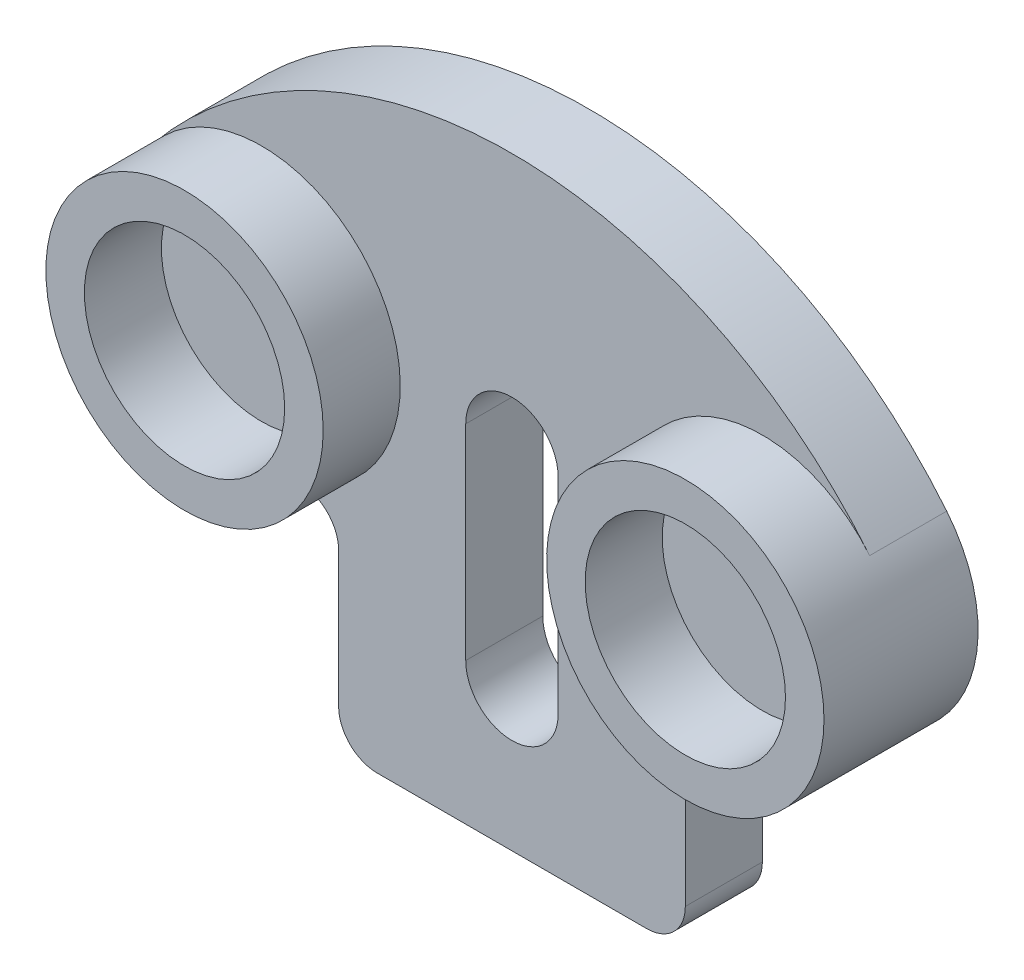
ISO-10303-21;
HEADER;
FILE_DESCRIPTION(('STEP AP214'),'2;1');
FILE_NAME('part.step','',(''),(''),'','','');
FILE_SCHEMA(('AUTOMOTIVE_DESIGN { 1 0 10303 214 1 1 1 1 }'));
ENDSEC;
DATA;
#1=APPLICATION_CONTEXT('core data for automotive mechanical design processes');
#2=APPLICATION_PROTOCOL_DEFINITION('international standard','automotive_design',2000,#1);
#3=PRODUCT_CONTEXT('',#1,'mechanical');
#4=PRODUCT('Part','Part','',(#3));
#5=PRODUCT_RELATED_PRODUCT_CATEGORY('part','',(#4));
#6=PRODUCT_DEFINITION_FORMATION('','',#4);
#7=PRODUCT_DEFINITION_CONTEXT('part definition',#1,'design');
#8=PRODUCT_DEFINITION('design','',#6,#7);
#9=PRODUCT_DEFINITION_SHAPE('','',#8);
#10=(LENGTH_UNIT() NAMED_UNIT(*) SI_UNIT(.MILLI.,.METRE.));
#11=(NAMED_UNIT(*) PLANE_ANGLE_UNIT() SI_UNIT($,.RADIAN.));
#12=(NAMED_UNIT(*) SI_UNIT($,.STERADIAN.) SOLID_ANGLE_UNIT());
#13=UNCERTAINTY_MEASURE_WITH_UNIT(LENGTH_MEASURE(1.E-05),#10,'distance_accuracy_value','');
#14=(GEOMETRIC_REPRESENTATION_CONTEXT(3) GLOBAL_UNCERTAINTY_ASSIGNED_CONTEXT((#13)) GLOBAL_UNIT_ASSIGNED_CONTEXT((#10,
#11,#12)) REPRESENTATION_CONTEXT('',''));
#15=CARTESIAN_POINT('',(0.,0.,0.));
#16=DIRECTION('',(0.,0.,1.));
#17=DIRECTION('',(1.,0.,0.));
#18=AXIS2_PLACEMENT_3D('',#15,#16,#17);
#19=CARTESIAN_POINT('',(-5.99999999999995,0.,10.));
#20=DIRECTION('',(-1.,0.,0.));
#21=DIRECTION('',(0.,0.,1.));
#22=AXIS2_PLACEMENT_3D('',#19,#20,#21);
#23=PLANE('',#22);
#24=DIRECTION('',(0.,1.,0.));
#25=VECTOR('',#24,1.);
#26=CARTESIAN_POINT('',(-5.99999999999995,0.,0.));
#27=LINE('',#26,#25);
#28=CARTESIAN_POINT('',(-5.99999999999995,0.,0.));
#29=VERTEX_POINT('',#28);
#30=CARTESIAN_POINT('',(-5.99999999999995,26.603571188846,0.));
#31=VERTEX_POINT('',#30);
#32=EDGE_CURVE('E231',#29,#31,#27,.T.);
#33=ORIENTED_EDGE('',*,*,#32,.T.);
#34=DIRECTION('',(0.,0.,-1.));
#35=VECTOR('',#34,1.);
#36=CARTESIAN_POINT('',(-5.99999999999995,26.603571188846,10.));
#37=LINE('',#36,#35);
#38=CARTESIAN_POINT('',(-5.99999999999995,26.603571188846,10.));
#39=VERTEX_POINT('',#38);
#40=EDGE_CURVE('E68',#39,#31,#37,.T.);
#41=ORIENTED_EDGE('',*,*,#40,.F.);
#42=DIRECTION('',(0.,1.,0.));
#43=VECTOR('',#42,1.);
#44=CARTESIAN_POINT('',(-5.99999999999995,0.,10.));
#45=LINE('',#44,#43);
#46=CARTESIAN_POINT('',(-5.99999999999995,0.,10.));
#47=VERTEX_POINT('',#46);
#48=EDGE_CURVE('E172',#47,#39,#45,.T.);
#49=ORIENTED_EDGE('',*,*,#48,.F.);
#50=DIRECTION('',(0.,0.,-1.));
#51=VECTOR('',#50,1.);
#52=CARTESIAN_POINT('',(-5.99999999999995,0.,10.));
#53=LINE('',#52,#51);
#54=EDGE_CURVE('E242',#47,#29,#53,.T.);
#55=ORIENTED_EDGE('',*,*,#54,.T.);
#56=EDGE_LOOP('',(#33,#41,#49,#55));
#57=FACE_BOUND('',#56,.T.);
#58=ADVANCED_FACE('F57',(#57),#23,.F.);
#59=CARTESIAN_POINT('',(0.,26.603571188846,10.));
#60=DIRECTION('',(0.,0.,-1.));
#61=DIRECTION('',(-1.,0.,0.));
#62=AXIS2_PLACEMENT_3D('',#59,#60,#61);
#63=CYLINDRICAL_SURFACE('',#62,5.99999999999999);
#64=CARTESIAN_POINT('',(0.,26.603571188846,0.));
#65=DIRECTION('',(0.,0.,1.));
#66=DIRECTION('',(1.,0.,0.));
#67=AXIS2_PLACEMENT_3D('',#64,#65,#66);
#68=CIRCLE('',#67,5.99999999999999);
#69=CARTESIAN_POINT('',(6.00000000000004,26.603571188846,0.));
#70=VERTEX_POINT('',#69);
#71=EDGE_CURVE('E180',#31,#70,#68,.F.);
#72=ORIENTED_EDGE('',*,*,#71,.T.);
#73=DIRECTION('',(0.,0.,-1.));
#74=VECTOR('',#73,1.);
#75=CARTESIAN_POINT('',(6.00000000000004,26.603571188846,10.));
#76=LINE('',#75,#74);
#77=CARTESIAN_POINT('',(6.00000000000004,26.603571188846,10.));
#78=VERTEX_POINT('',#77);
#79=EDGE_CURVE('E178',#78,#70,#76,.T.);
#80=ORIENTED_EDGE('',*,*,#79,.F.);
#81=CARTESIAN_POINT('',(0.,26.603571188846,10.));
#82=DIRECTION('',(0.,0.,1.));
#83=DIRECTION('',(1.,0.,0.));
#84=AXIS2_PLACEMENT_3D('',#81,#82,#83);
#85=CIRCLE('',#84,5.99999999999999);
#86=EDGE_CURVE('E166',#39,#78,#85,.F.);
#87=ORIENTED_EDGE('',*,*,#86,.F.);
#88=ORIENTED_EDGE('',*,*,#40,.T.);
#89=EDGE_LOOP('',(#72,#80,#87,#88));
#90=FACE_BOUND('',#89,.T.);
#91=ADVANCED_FACE('F179',(#90),#63,.F.);
#92=CARTESIAN_POINT('',(6.00000000000006,0.,10.));
#93=DIRECTION('',(1.,0.,0.));
#94=DIRECTION('',(0.,1.,0.));
#95=AXIS2_PLACEMENT_3D('',#92,#93,#94);
#96=PLANE('',#95);
#97=DIRECTION('',(0.,-1.,0.));
#98=VECTOR('',#97,1.);
#99=CARTESIAN_POINT('',(6.00000000000006,0.,0.));
#100=LINE('',#99,#98);
#101=CARTESIAN_POINT('',(6.00000000000006,0.,0.));
#102=VERTEX_POINT('',#101);
#103=EDGE_CURVE('E125',#70,#102,#100,.T.);
#104=ORIENTED_EDGE('',*,*,#103,.T.);
#105=DIRECTION('',(0.,0.,-1.));
#106=VECTOR('',#105,1.);
#107=CARTESIAN_POINT('',(6.00000000000006,0.,10.));
#108=LINE('',#107,#106);
#109=CARTESIAN_POINT('',(6.00000000000006,0.,10.));
#110=VERTEX_POINT('',#109);
#111=EDGE_CURVE('E182',#110,#102,#108,.T.);
#112=ORIENTED_EDGE('',*,*,#111,.F.);
#113=DIRECTION('',(0.,-1.,0.));
#114=VECTOR('',#113,1.);
#115=CARTESIAN_POINT('',(6.00000000000006,0.,10.));
#116=LINE('',#115,#114);
#117=EDGE_CURVE('E170',#78,#110,#116,.T.);
#118=ORIENTED_EDGE('',*,*,#117,.F.);
#119=ORIENTED_EDGE('',*,*,#79,.T.);
#120=EDGE_LOOP('',(#104,#112,#118,#119));
#121=FACE_BOUND('',#120,.T.);
#122=ADVANCED_FACE('F184',(#121),#96,.F.);
#123=CARTESIAN_POINT('',(-17.5,-13.3964288111539,10.));
#124=DIRECTION('',(0.,0.,-1.));
#125=DIRECTION('',(-1.,0.,0.));
#126=AXIS2_PLACEMENT_3D('',#123,#124,#125);
#127=CYLINDRICAL_SURFACE('',#126,5.);
#128=CARTESIAN_POINT('',(-17.5,-13.3964288111539,0.));
#129=DIRECTION('',(0.,0.,1.));
#130=DIRECTION('',(1.,0.,0.));
#131=AXIS2_PLACEMENT_3D('',#128,#129,#130);
#132=CIRCLE('',#131,5.);
#133=CARTESIAN_POINT('',(-17.5,-18.3964288111539,0.));
#134=VERTEX_POINT('',#133);
#135=CARTESIAN_POINT('',(-22.5,-13.3964288111539,0.));
#136=VERTEX_POINT('',#135);
#137=EDGE_CURVE('E192',#134,#136,#132,.F.);
#138=ORIENTED_EDGE('',*,*,#137,.F.);
#139=DIRECTION('',(0.,0.,-1.));
#140=VECTOR('',#139,1.);
#141=CARTESIAN_POINT('',(-17.5,-18.3964288111539,10.));
#142=LINE('',#141,#140);
#143=CARTESIAN_POINT('',(-17.5,-18.3964288111539,10.));
#144=VERTEX_POINT('',#143);
#145=EDGE_CURVE('E61',#144,#134,#142,.T.);
#146=ORIENTED_EDGE('',*,*,#145,.F.);
#147=CARTESIAN_POINT('',(-17.5,-13.3964288111539,10.));
#148=DIRECTION('',(0.,0.,1.));
#149=DIRECTION('',(1.,0.,0.));
#150=AXIS2_PLACEMENT_3D('',#147,#148,#149);
#151=CIRCLE('',#150,5.);
#152=CARTESIAN_POINT('',(-22.5,-13.3964288111539,10.));
#153=VERTEX_POINT('',#152);
#154=EDGE_CURVE('E241',#144,#153,#151,.F.);
#155=ORIENTED_EDGE('',*,*,#154,.T.);
#156=DIRECTION('',(0.,0.,-1.));
#157=VECTOR('',#156,1.);
#158=CARTESIAN_POINT('',(-22.5,-13.3964288111539,10.));
#159=LINE('',#158,#157);
#160=EDGE_CURVE('E188',#153,#136,#159,.T.);
#161=ORIENTED_EDGE('',*,*,#160,.T.);
#162=EDGE_LOOP('',(#138,#146,#155,#161));
#163=FACE_BOUND('',#162,.T.);
#164=ADVANCED_FACE('F59',(#163),#127,.T.);
#165=CARTESIAN_POINT('',(0.,-18.3964288111539,10.));
#166=DIRECTION('',(0.,-1.,0.));
#167=DIRECTION('',(0.,0.,-1.));
#168=AXIS2_PLACEMENT_3D('',#165,#166,#167);
#169=PLANE('',#168);
#170=DIRECTION('',(-1.,0.,0.));
#171=VECTOR('',#170,1.);
#172=CARTESIAN_POINT('',(0.,-18.3964288111539,0.));
#173=LINE('',#172,#171);
#174=CARTESIAN_POINT('',(17.5,-18.3964288111539,0.));
#175=VERTEX_POINT('',#174);
#176=EDGE_CURVE('E196',#175,#134,#173,.T.);
#177=ORIENTED_EDGE('',*,*,#176,.F.);
#178=DIRECTION('',(0.,0.,-1.));
#179=VECTOR('',#178,1.);
#180=CARTESIAN_POINT('',(17.5,-18.3964288111539,10.));
#181=LINE('',#180,#179);
#182=CARTESIAN_POINT('',(17.5,-18.3964288111539,10.));
#183=VERTEX_POINT('',#182);
#184=EDGE_CURVE('E273',#183,#175,#181,.T.);
#185=ORIENTED_EDGE('',*,*,#184,.F.);
#186=DIRECTION('',(-1.,0.,0.));
#187=VECTOR('',#186,1.);
#188=CARTESIAN_POINT('',(0.,-18.3964288111539,10.));
#189=LINE('',#188,#187);
#190=EDGE_CURVE('E284',#183,#144,#189,.T.);
#191=ORIENTED_EDGE('',*,*,#190,.T.);
#192=ORIENTED_EDGE('',*,*,#145,.T.);
#193=EDGE_LOOP('',(#177,#185,#191,#192));
#194=FACE_BOUND('',#193,.T.);
#195=ADVANCED_FACE('F282',(#194),#169,.T.);
#196=CARTESIAN_POINT('',(17.5,-13.3964288111539,10.));
#197=DIRECTION('',(0.,0.,-1.));
#198=DIRECTION('',(-1.,0.,0.));
#199=AXIS2_PLACEMENT_3D('',#196,#197,#198);
#200=CYLINDRICAL_SURFACE('',#199,5.);
#201=CARTESIAN_POINT('',(17.5,-13.3964288111539,0.));
#202=DIRECTION('',(0.,0.,1.));
#203=DIRECTION('',(1.,0.,0.));
#204=AXIS2_PLACEMENT_3D('',#201,#202,#203);
#205=CIRCLE('',#204,5.);
#206=CARTESIAN_POINT('',(22.5,-13.3964288111539,0.));
#207=VERTEX_POINT('',#206);
#208=EDGE_CURVE('E201',#175,#207,#205,.T.);
#209=ORIENTED_EDGE('',*,*,#208,.T.);
#210=DIRECTION('',(0.,0.,-1.));
#211=VECTOR('',#210,1.);
#212=CARTESIAN_POINT('',(22.5,-13.3964288111539,10.));
#213=LINE('',#212,#211);
#214=CARTESIAN_POINT('',(22.5,-13.3964288111539,10.));
#215=VERTEX_POINT('',#214);
#216=EDGE_CURVE('E270',#215,#207,#213,.T.);
#217=ORIENTED_EDGE('',*,*,#216,.F.);
#218=CARTESIAN_POINT('',(17.5,-13.3964288111539,10.));
#219=DIRECTION('',(0.,0.,1.));
#220=DIRECTION('',(1.,0.,0.));
#221=AXIS2_PLACEMENT_3D('',#218,#219,#220);
#222=CIRCLE('',#221,5.);
#223=EDGE_CURVE('E302',#183,#215,#222,.T.);
#224=ORIENTED_EDGE('',*,*,#223,.F.);
#225=ORIENTED_EDGE('',*,*,#184,.T.);
#226=EDGE_LOOP('',(#209,#217,#224,#225));
#227=FACE_BOUND('',#226,.T.);
#228=ADVANCED_FACE('F291',(#227),#200,.T.);
#229=CARTESIAN_POINT('',(22.5,0.,10.));
#230=DIRECTION('',(-1.,0.,0.));
#231=DIRECTION('',(0.,-1.,0.));
#232=AXIS2_PLACEMENT_3D('',#229,#230,#231);
#233=PLANE('',#232);
#234=DIRECTION('',(0.,1.,0.));
#235=VECTOR('',#234,1.);
#236=CARTESIAN_POINT('',(22.5,0.,0.));
#237=LINE('',#236,#235);
#238=CARTESIAN_POINT('',(22.5,4.1536268682024,0.));
#239=VERTEX_POINT('',#238);
#240=EDGE_CURVE('E204',#207,#239,#237,.T.);
#241=ORIENTED_EDGE('',*,*,#240,.T.);
#242=DIRECTION('',(0.,0.,-1.));
#243=VECTOR('',#242,1.);
#244=CARTESIAN_POINT('',(22.5,4.1536268682024,10.));
#245=LINE('',#244,#243);
#246=CARTESIAN_POINT('',(22.5,4.1536268682024,10.));
#247=VERTEX_POINT('',#246);
#248=EDGE_CURVE('E267',#247,#239,#245,.T.);
#249=ORIENTED_EDGE('',*,*,#248,.F.);
#250=DIRECTION('',(0.,1.,0.));
#251=VECTOR('',#250,1.);
#252=CARTESIAN_POINT('',(22.5,0.,10.));
#253=LINE('',#252,#251);
#254=EDGE_CURVE('E296',#215,#247,#253,.T.);
#255=ORIENTED_EDGE('',*,*,#254,.F.);
#256=ORIENTED_EDGE('',*,*,#216,.T.);
#257=EDGE_LOOP('',(#241,#249,#255,#256));
#258=FACE_BOUND('',#257,.T.);
#259=ADVANCED_FACE('F294',(#258),#233,.F.);
#260=CARTESIAN_POINT('',(27.5,4.1536268682024,10.));
#261=DIRECTION('',(0.,0.,-1.));
#262=DIRECTION('',(-1.,0.,0.));
#263=AXIS2_PLACEMENT_3D('',#260,#261,#262);
#264=CYLINDRICAL_SURFACE('',#263,5.);
#265=CARTESIAN_POINT('',(27.5,4.1536268682024,0.));
#266=DIRECTION('',(0.,0.,1.));
#267=DIRECTION('',(1.,0.,0.));
#268=AXIS2_PLACEMENT_3D('',#265,#266,#267);
#269=CIRCLE('',#268,5.);
#270=CARTESIAN_POINT('',(28.5869565217391,9.03404954660319,0.));
#271=VERTEX_POINT('',#270);
#272=EDGE_CURVE('E208',#271,#239,#269,.T.);
#273=ORIENTED_EDGE('',*,*,#272,.F.);
#274=DIRECTION('',(0.,0.,-1.));
#275=VECTOR('',#274,1.);
#276=CARTESIAN_POINT('',(28.5869565217391,9.03404954660319,10.));
#277=LINE('',#276,#275);
#278=CARTESIAN_POINT('',(28.5869565217391,9.03404954660319,10.));
#279=VERTEX_POINT('',#278);
#280=EDGE_CURVE('E264',#279,#271,#277,.T.);
#281=ORIENTED_EDGE('',*,*,#280,.F.);
#282=CARTESIAN_POINT('',(27.5,4.1536268682024,10.));
#283=DIRECTION('',(0.,0.,1.));
#284=DIRECTION('',(1.,0.,0.));
#285=AXIS2_PLACEMENT_3D('',#282,#283,#284);
#286=CIRCLE('',#285,5.);
#287=EDGE_CURVE('E301',#279,#247,#286,.T.);
#288=ORIENTED_EDGE('',*,*,#287,.T.);
#289=ORIENTED_EDGE('',*,*,#248,.T.);
#290=EDGE_LOOP('',(#273,#281,#288,#289));
#291=FACE_BOUND('',#290,.T.);
#292=ADVANCED_FACE('F417',(#291),#264,.F.);
#293=CARTESIAN_POINT('',(32.5,26.6035711888461,10.));
#294=DIRECTION('',(0.,0.,-1.));
#295=DIRECTION('',(-1.,0.,0.));
#296=AXIS2_PLACEMENT_3D('',#293,#294,#295);
#297=CYLINDRICAL_SURFACE('',#296,18.);
#298=CARTESIAN_POINT('',(32.5,26.6035711888461,0.));
#299=DIRECTION('',(0.,0.,1.));
#300=DIRECTION('',(1.,0.,0.));
#301=AXIS2_PLACEMENT_3D('',#298,#299,#300);
#302=CIRCLE('',#301,18.);
#303=CARTESIAN_POINT('',(46.4285714285714,38.0051016983515,0.));
#304=VERTEX_POINT('',#303);
#305=EDGE_CURVE('E212',#271,#304,#302,.T.);
#306=ORIENTED_EDGE('',*,*,#305,.T.);
#307=DIRECTION('',(0.,0.,-1.));
#308=VECTOR('',#307,1.);
#309=CARTESIAN_POINT('',(46.4285714285714,38.0051016983515,10.));
#310=LINE('',#309,#308);
#311=CARTESIAN_POINT('',(46.4285714285714,38.0051016983515,10.));
#312=VERTEX_POINT('',#311);
#313=EDGE_CURVE('E260',#312,#304,#310,.T.);
#314=ORIENTED_EDGE('',*,*,#313,.F.);
#315=CARTESIAN_POINT('',(32.5,26.6035711888461,10.));
#316=DIRECTION('',(0.,0.,1.));
#317=DIRECTION('',(1.,0.,0.));
#318=AXIS2_PLACEMENT_3D('',#315,#316,#317);
#319=CIRCLE('',#318,18.);
#320=EDGE_CURVE('E347',#312,#279,#319,.T.);
#321=ORIENTED_EDGE('',*,*,#320,.T.);
#322=ORIENTED_EDGE('',*,*,#280,.T.);
#323=EDGE_LOOP('',(#306,#314,#321,#322));
#324=FACE_BOUND('',#323,.T.);
#325=CARTESIAN_POINT('',(32.5,26.6035711888461,20.));
#326=DIRECTION('',(0.,0.,1.));
#327=DIRECTION('',(1.,0.,0.));
#328=AXIS2_PLACEMENT_3D('',#325,#326,#327);
#329=CIRCLE('',#328,18.);
#330=CARTESIAN_POINT('',(50.5,26.6035711888461,20.));
#331=VERTEX_POINT('',#330);
#332=EDGE_CURVE('E349',#331,#331,#329,.T.);
#333=ORIENTED_EDGE('',*,*,#332,.F.);
#334=EDGE_LOOP('',(#333));
#335=FACE_BOUND('',#334,.T.);
#336=ADVANCED_FACE('F345',(#324,#335),#297,.T.);
#337=CARTESIAN_POINT('',(0.,0.,10.));
#338=DIRECTION('',(0.,0.,-1.));
#339=DIRECTION('',(-1.,0.,0.));
#340=AXIS2_PLACEMENT_3D('',#337,#338,#339);
#341=CYLINDRICAL_SURFACE('',#340,60.);
#342=CARTESIAN_POINT('',(0.,0.,0.));
#343=DIRECTION('',(0.,0.,1.));
#344=DIRECTION('',(1.,0.,0.));
#345=AXIS2_PLACEMENT_3D('',#342,#343,#344);
#346=CIRCLE('',#345,60.);
#347=CARTESIAN_POINT('',(-46.4285714285714,38.0051016983515,0.));
#348=VERTEX_POINT('',#347);
#349=EDGE_CURVE('E215',#304,#348,#346,.T.);
#350=ORIENTED_EDGE('',*,*,#349,.T.);
#351=DIRECTION('',(0.,0.,-1.));
#352=VECTOR('',#351,1.);
#353=CARTESIAN_POINT('',(-46.4285714285714,38.0051016983515,10.));
#354=LINE('',#353,#352);
#355=CARTESIAN_POINT('',(-46.4285714285714,38.0051016983515,10.));
#356=VERTEX_POINT('',#355);
#357=EDGE_CURVE('E257',#356,#348,#354,.T.);
#358=ORIENTED_EDGE('',*,*,#357,.F.);
#359=CARTESIAN_POINT('',(0.,0.,10.));
#360=DIRECTION('',(0.,0.,1.));
#361=DIRECTION('',(1.,0.,0.));
#362=AXIS2_PLACEMENT_3D('',#359,#360,#361);
#363=CIRCLE('',#362,60.);
#364=EDGE_CURVE('E306',#312,#356,#363,.T.);
#365=ORIENTED_EDGE('',*,*,#364,.F.);
#366=ORIENTED_EDGE('',*,*,#313,.T.);
#367=EDGE_LOOP('',(#350,#358,#365,#366));
#368=FACE_BOUND('',#367,.T.);
#369=ADVANCED_FACE('F339',(#368),#341,.T.);
#370=CARTESIAN_POINT('',(-32.5,26.6035711888461,10.));
#371=DIRECTION('',(0.,0.,-1.));
#372=DIRECTION('',(-1.,0.,0.));
#373=AXIS2_PLACEMENT_3D('',#370,#371,#372);
#374=CYLINDRICAL_SURFACE('',#373,18.);
#375=CARTESIAN_POINT('',(-32.5,26.6035711888461,0.));
#376=DIRECTION('',(0.,0.,1.));
#377=DIRECTION('',(1.,0.,0.));
#378=AXIS2_PLACEMENT_3D('',#375,#376,#377);
#379=CIRCLE('',#378,18.);
#380=CARTESIAN_POINT('',(-28.5869565217391,9.03404954660319,0.));
#381=VERTEX_POINT('',#380);
#382=EDGE_CURVE('E219',#381,#348,#379,.F.);
#383=ORIENTED_EDGE('',*,*,#382,.F.);
#384=DIRECTION('',(0.,0.,-1.));
#385=VECTOR('',#384,1.);
#386=CARTESIAN_POINT('',(-28.5869565217391,9.03404954660319,10.));
#387=LINE('',#386,#385);
#388=CARTESIAN_POINT('',(-28.5869565217391,9.03404954660319,10.));
#389=VERTEX_POINT('',#388);
#390=EDGE_CURVE('E254',#389,#381,#387,.T.);
#391=ORIENTED_EDGE('',*,*,#390,.F.);
#392=CARTESIAN_POINT('',(-32.5,26.6035711888461,10.));
#393=DIRECTION('',(0.,0.,1.));
#394=DIRECTION('',(1.,0.,0.));
#395=AXIS2_PLACEMENT_3D('',#392,#393,#394);
#396=CIRCLE('',#395,18.);
#397=EDGE_CURVE('E12',#389,#356,#396,.T.);
#398=ORIENTED_EDGE('',*,*,#397,.T.);
#399=ORIENTED_EDGE('',*,*,#357,.T.);
#400=EDGE_LOOP('',(#383,#391,#398,#399));
#401=FACE_BOUND('',#400,.T.);
#402=CARTESIAN_POINT('',(-32.5,26.6035711888461,20.));
#403=DIRECTION('',(0.,0.,1.));
#404=DIRECTION('',(1.,0.,0.));
#405=AXIS2_PLACEMENT_3D('',#402,#403,#404);
#406=CIRCLE('',#405,18.);
#407=CARTESIAN_POINT('',(-14.5,26.6035711888461,20.));
#408=VERTEX_POINT('',#407);
#409=EDGE_CURVE('E197',#408,#408,#406,.T.);
#410=ORIENTED_EDGE('',*,*,#409,.F.);
#411=EDGE_LOOP('',(#410));
#412=FACE_BOUND('',#411,.T.);
#413=ADVANCED_FACE('F334',(#401,#412),#374,.T.);
#414=CARTESIAN_POINT('',(-27.5,4.1536268682024,10.));
#415=DIRECTION('',(0.,0.,-1.));
#416=DIRECTION('',(-1.,0.,0.));
#417=AXIS2_PLACEMENT_3D('',#414,#415,#416);
#418=CYLINDRICAL_SURFACE('',#417,4.99999999999999);
#419=CARTESIAN_POINT('',(-27.5,4.1536268682024,0.));
#420=DIRECTION('',(0.,0.,1.));
#421=DIRECTION('',(1.,0.,0.));
#422=AXIS2_PLACEMENT_3D('',#419,#420,#421);
#423=CIRCLE('',#422,4.99999999999999);
#424=CARTESIAN_POINT('',(-22.5,4.1536268682024,0.));
#425=VERTEX_POINT('',#424);
#426=EDGE_CURVE('E223',#425,#381,#423,.T.);
#427=ORIENTED_EDGE('',*,*,#426,.F.);
#428=DIRECTION('',(0.,0.,-1.));
#429=VECTOR('',#428,1.);
#430=CARTESIAN_POINT('',(-22.5,4.1536268682024,10.));
#431=LINE('',#430,#429);
#432=CARTESIAN_POINT('',(-22.5,4.1536268682024,10.));
#433=VERTEX_POINT('',#432);
#434=EDGE_CURVE('E251',#433,#425,#431,.T.);
#435=ORIENTED_EDGE('',*,*,#434,.F.);
#436=CARTESIAN_POINT('',(-27.5,4.1536268682024,10.));
#437=DIRECTION('',(0.,0.,1.));
#438=DIRECTION('',(1.,0.,0.));
#439=AXIS2_PLACEMENT_3D('',#436,#437,#438);
#440=CIRCLE('',#439,4.99999999999999);
#441=EDGE_CURVE('E314',#433,#389,#440,.T.);
#442=ORIENTED_EDGE('',*,*,#441,.T.);
#443=ORIENTED_EDGE('',*,*,#390,.T.);
#444=EDGE_LOOP('',(#427,#435,#442,#443));
#445=FACE_BOUND('',#444,.T.);
#446=ADVANCED_FACE('F329',(#445),#418,.F.);
#447=CARTESIAN_POINT('',(-22.5,0.,10.));
#448=DIRECTION('',(-1.,0.,0.));
#449=DIRECTION('',(0.,-1.,0.));
#450=AXIS2_PLACEMENT_3D('',#447,#448,#449);
#451=PLANE('',#450);
#452=DIRECTION('',(0.,1.,0.));
#453=VECTOR('',#452,1.);
#454=CARTESIAN_POINT('',(-22.5,0.,0.));
#455=LINE('',#454,#453);
#456=EDGE_CURVE('E227',#136,#425,#455,.T.);
#457=ORIENTED_EDGE('',*,*,#456,.F.);
#458=ORIENTED_EDGE('',*,*,#160,.F.);
#459=DIRECTION('',(0.,1.,0.));
#460=VECTOR('',#459,1.);
#461=CARTESIAN_POINT('',(-22.5,0.,10.));
#462=LINE('',#461,#460);
#463=EDGE_CURVE('E318',#153,#433,#462,.T.);
#464=ORIENTED_EDGE('',*,*,#463,.T.);
#465=ORIENTED_EDGE('',*,*,#434,.T.);
#466=EDGE_LOOP('',(#457,#458,#464,#465));
#467=FACE_BOUND('',#466,.T.);
#468=ADVANCED_FACE('F324',(#467),#451,.T.);
#469=CARTESIAN_POINT('',(0.,0.,10.));
#470=DIRECTION('',(0.,0.,-1.));
#471=DIRECTION('',(-1.,0.,0.));
#472=AXIS2_PLACEMENT_3D('',#469,#470,#471);
#473=CYLINDRICAL_SURFACE('',#472,6.);
#474=CARTESIAN_POINT('',(0.,0.,0.));
#475=DIRECTION('',(0.,0.,1.));
#476=DIRECTION('',(1.,0.,0.));
#477=AXIS2_PLACEMENT_3D('',#474,#475,#476);
#478=CIRCLE('',#477,6.);
#479=EDGE_CURVE('E131',#102,#29,#478,.F.);
#480=ORIENTED_EDGE('',*,*,#479,.T.);
#481=ORIENTED_EDGE('',*,*,#54,.F.);
#482=CARTESIAN_POINT('',(0.,0.,10.));
#483=DIRECTION('',(0.,0.,1.));
#484=DIRECTION('',(1.,0.,0.));
#485=AXIS2_PLACEMENT_3D('',#482,#483,#484);
#486=CIRCLE('',#485,6.);
#487=EDGE_CURVE('E77',#110,#47,#486,.F.);
#488=ORIENTED_EDGE('',*,*,#487,.F.);
#489=ORIENTED_EDGE('',*,*,#111,.T.);
#490=EDGE_LOOP('',(#480,#481,#488,#489));
#491=FACE_BOUND('',#490,.T.);
#492=ADVANCED_FACE('F408',(#491),#473,.F.);
#493=CARTESIAN_POINT('',(0.,0.,10.));
#494=DIRECTION('',(0.,0.,1.));
#495=DIRECTION('',(1.,0.,0.));
#496=AXIS2_PLACEMENT_3D('',#493,#494,#495);
#497=PLANE('',#496);
#498=ORIENTED_EDGE('',*,*,#397,.F.);
#499=ORIENTED_EDGE('',*,*,#441,.F.);
#500=ORIENTED_EDGE('',*,*,#463,.F.);
#501=ORIENTED_EDGE('',*,*,#154,.F.);
#502=ORIENTED_EDGE('',*,*,#190,.F.);
#503=ORIENTED_EDGE('',*,*,#223,.T.);
#504=ORIENTED_EDGE('',*,*,#254,.T.);
#505=ORIENTED_EDGE('',*,*,#287,.F.);
#506=ORIENTED_EDGE('',*,*,#320,.F.);
#507=ORIENTED_EDGE('',*,*,#364,.T.);
#508=EDGE_LOOP('',(#498,#499,#500,#501,#502,#503,#504,#505,#506,#507));
#509=FACE_BOUND('',#508,.T.);
#510=ORIENTED_EDGE('',*,*,#48,.T.);
#511=ORIENTED_EDGE('',*,*,#86,.T.);
#512=ORIENTED_EDGE('',*,*,#117,.T.);
#513=ORIENTED_EDGE('',*,*,#487,.T.);
#514=EDGE_LOOP('',(#510,#511,#512,#513));
#515=FACE_BOUND('',#514,.T.);
#516=ADVANCED_FACE('F168',(#509,#515),#497,.T.);
#517=CARTESIAN_POINT('',(0.,0.,0.));
#518=DIRECTION('',(0.,0.,1.));
#519=DIRECTION('',(1.,0.,0.));
#520=AXIS2_PLACEMENT_3D('',#517,#518,#519);
#521=PLANE('',#520);
#522=ORIENTED_EDGE('',*,*,#137,.T.);
#523=ORIENTED_EDGE('',*,*,#456,.T.);
#524=ORIENTED_EDGE('',*,*,#426,.T.);
#525=ORIENTED_EDGE('',*,*,#382,.T.);
#526=ORIENTED_EDGE('',*,*,#349,.F.);
#527=ORIENTED_EDGE('',*,*,#305,.F.);
#528=ORIENTED_EDGE('',*,*,#272,.T.);
#529=ORIENTED_EDGE('',*,*,#240,.F.);
#530=ORIENTED_EDGE('',*,*,#208,.F.);
#531=ORIENTED_EDGE('',*,*,#176,.T.);
#532=EDGE_LOOP('',(#522,#523,#524,#525,#526,#527,#528,#529,#530,#531));
#533=FACE_BOUND('',#532,.T.);
#534=ORIENTED_EDGE('',*,*,#32,.F.);
#535=ORIENTED_EDGE('',*,*,#479,.F.);
#536=ORIENTED_EDGE('',*,*,#103,.F.);
#537=ORIENTED_EDGE('',*,*,#71,.F.);
#538=EDGE_LOOP('',(#534,#535,#536,#537));
#539=FACE_BOUND('',#538,.T.);
#540=ADVANCED_FACE('F287',(#533,#539),#521,.F.);
#541=CARTESIAN_POINT('',(32.5,26.6035711888461,20.));
#542=DIRECTION('',(0.,0.,1.));
#543=DIRECTION('',(1.,0.,0.));
#544=AXIS2_PLACEMENT_3D('',#541,#542,#543);
#545=PLANE('',#544);
#546=ORIENTED_EDGE('',*,*,#332,.T.);
#547=EDGE_LOOP('',(#546));
#548=FACE_BOUND('',#547,.T.);
#549=CARTESIAN_POINT('',(32.5,26.6035711888461,20.));
#550=DIRECTION('',(0.,0.,1.));
#551=DIRECTION('',(1.,0.,0.));
#552=AXIS2_PLACEMENT_3D('',#549,#550,#551);
#553=CIRCLE('',#552,13.);
#554=CARTESIAN_POINT('',(45.5,26.6035711888461,20.));
#555=VERTEX_POINT('',#554);
#556=EDGE_CURVE('E350',#555,#555,#553,.T.);
#557=ORIENTED_EDGE('',*,*,#556,.F.);
#558=EDGE_LOOP('',(#557));
#559=FACE_BOUND('',#558,.T.);
#560=ADVANCED_FACE('F385',(#548,#559),#545,.T.);
#561=CARTESIAN_POINT('',(32.5,26.6035711888461,20.));
#562=DIRECTION('',(0.,0.,-1.));
#563=DIRECTION('',(-1.,0.,0.));
#564=AXIS2_PLACEMENT_3D('',#561,#562,#563);
#565=CYLINDRICAL_SURFACE('',#564,13.);
#566=ORIENTED_EDGE('',*,*,#556,.T.);
#567=EDGE_LOOP('',(#566));
#568=FACE_BOUND('',#567,.T.);
#569=CARTESIAN_POINT('',(32.5,26.6035711888461,10.));
#570=DIRECTION('',(0.,0.,1.));
#571=DIRECTION('',(1.,0.,0.));
#572=AXIS2_PLACEMENT_3D('',#569,#570,#571);
#573=CIRCLE('',#572,13.);
#574=CARTESIAN_POINT('',(45.5,26.6035711888461,10.));
#575=VERTEX_POINT('',#574);
#576=EDGE_CURVE('E358',#575,#575,#573,.T.);
#577=ORIENTED_EDGE('',*,*,#576,.F.);
#578=EDGE_LOOP('',(#577));
#579=FACE_BOUND('',#578,.T.);
#580=ADVANCED_FACE('F382',(#568,#579),#565,.F.);
#581=CARTESIAN_POINT('',(-32.5,26.6035711888461,20.));
#582=DIRECTION('',(0.,0.,1.));
#583=DIRECTION('',(1.,0.,0.));
#584=AXIS2_PLACEMENT_3D('',#581,#582,#583);
#585=PLANE('',#584);
#586=ORIENTED_EDGE('',*,*,#409,.T.);
#587=EDGE_LOOP('',(#586));
#588=FACE_BOUND('',#587,.T.);
#589=CARTESIAN_POINT('',(-32.5,26.6035711888461,20.));
#590=DIRECTION('',(0.,0.,1.));
#591=DIRECTION('',(1.,0.,0.));
#592=AXIS2_PLACEMENT_3D('',#589,#590,#591);
#593=CIRCLE('',#592,13.);
#594=CARTESIAN_POINT('',(-19.5,26.6035711888461,20.));
#595=VERTEX_POINT('',#594);
#596=EDGE_CURVE('E367',#595,#595,#593,.T.);
#597=ORIENTED_EDGE('',*,*,#596,.F.);
#598=EDGE_LOOP('',(#597));
#599=FACE_BOUND('',#598,.T.);
#600=ADVANCED_FACE('F384',(#588,#599),#585,.T.);
#601=CARTESIAN_POINT('',(-32.5,26.6035711888461,20.));
#602=DIRECTION('',(0.,0.,-1.));
#603=DIRECTION('',(-1.,0.,0.));
#604=AXIS2_PLACEMENT_3D('',#601,#602,#603);
#605=CYLINDRICAL_SURFACE('',#604,13.);
#606=ORIENTED_EDGE('',*,*,#596,.T.);
#607=EDGE_LOOP('',(#606));
#608=FACE_BOUND('',#607,.T.);
#609=CARTESIAN_POINT('',(-32.5,26.6035711888461,10.));
#610=DIRECTION('',(0.,0.,1.));
#611=DIRECTION('',(1.,0.,0.));
#612=AXIS2_PLACEMENT_3D('',#609,#610,#611);
#613=CIRCLE('',#612,13.);
#614=CARTESIAN_POINT('',(-19.5,26.6035711888461,10.));
#615=VERTEX_POINT('',#614);
#616=EDGE_CURVE('E355',#615,#615,#613,.T.);
#617=ORIENTED_EDGE('',*,*,#616,.F.);
#618=EDGE_LOOP('',(#617));
#619=FACE_BOUND('',#618,.T.);
#620=ADVANCED_FACE('F392',(#608,#619),#605,.F.);
#621=ORIENTED_EDGE('',*,*,#576,.T.);
#622=EDGE_LOOP('',(#621));
#623=FACE_BOUND('',#622,.T.);
#624=ADVANCED_FACE('F380',(#623),#497,.T.);
#625=ORIENTED_EDGE('',*,*,#616,.T.);
#626=EDGE_LOOP('',(#625));
#627=FACE_BOUND('',#626,.T.);
#628=ADVANCED_FACE('F439',(#627),#497,.T.);
#629=CLOSED_SHELL('',(#58,#91,#122,#164,#195,#228,#259,#292,#336,#369,#413,#446,#468,#492,#516,
#540,#560,#580,#600,#620,#624,#628));
#630=MANIFOLD_SOLID_BREP('B2',#629);
#631=ADVANCED_BREP_SHAPE_REPRESENTATION('',(#18,#630),#14);
#632=SHAPE_DEFINITION_REPRESENTATION(#9,#631);
ENDSEC;
END-ISO-10303-21;
